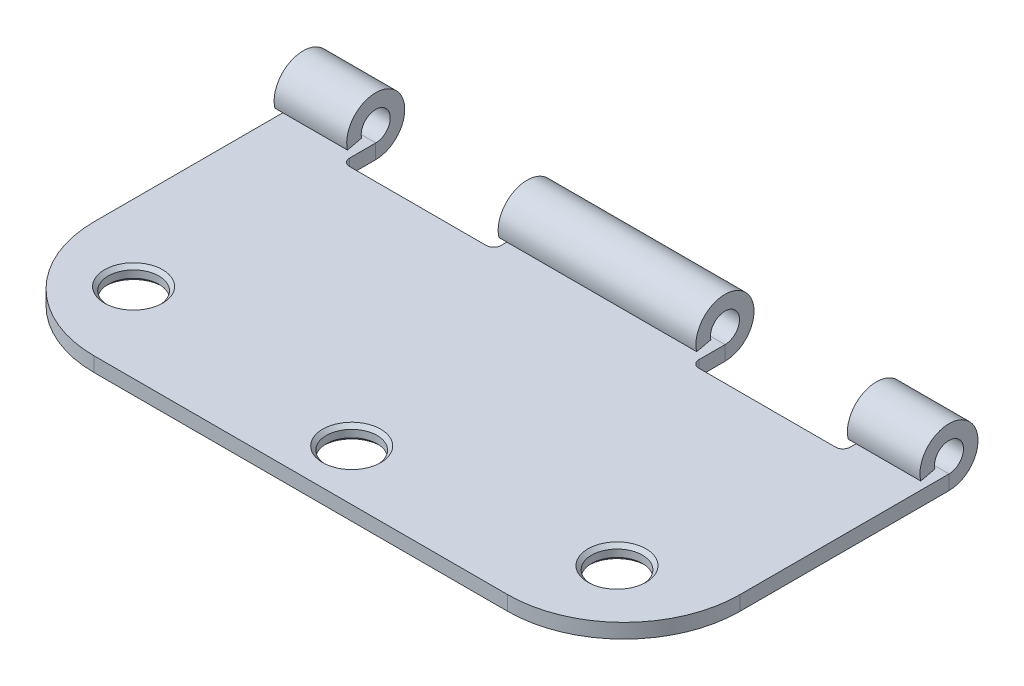
ISO-10303-21;
HEADER;
FILE_DESCRIPTION(('STEP AP214'),'2;1');
FILE_NAME('part.step','',(''),(''),'','','');
FILE_SCHEMA(('AUTOMOTIVE_DESIGN { 1 0 10303 214 1 1 1 1 }'));
ENDSEC;
DATA;
#1=APPLICATION_CONTEXT('core data for automotive mechanical design processes');
#2=APPLICATION_PROTOCOL_DEFINITION('international standard','automotive_design',2000,#1);
#3=PRODUCT_CONTEXT('',#1,'mechanical');
#4=PRODUCT('Part','Part','',(#3));
#5=PRODUCT_RELATED_PRODUCT_CATEGORY('part','',(#4));
#6=PRODUCT_DEFINITION_FORMATION('','',#4);
#7=PRODUCT_DEFINITION_CONTEXT('part definition',#1,'design');
#8=PRODUCT_DEFINITION('design','',#6,#7);
#9=PRODUCT_DEFINITION_SHAPE('','',#8);
#10=(LENGTH_UNIT() NAMED_UNIT(*) SI_UNIT(.MILLI.,.METRE.));
#11=(NAMED_UNIT(*) PLANE_ANGLE_UNIT() SI_UNIT($,.RADIAN.));
#12=(NAMED_UNIT(*) SI_UNIT($,.STERADIAN.) SOLID_ANGLE_UNIT());
#13=UNCERTAINTY_MEASURE_WITH_UNIT(LENGTH_MEASURE(1.E-05),#10,'distance_accuracy_value','');
#14=(GEOMETRIC_REPRESENTATION_CONTEXT(3) GLOBAL_UNCERTAINTY_ASSIGNED_CONTEXT((#13)) GLOBAL_UNIT_ASSIGNED_CONTEXT((#10,
#11,#12)) REPRESENTATION_CONTEXT('',''));
#15=CARTESIAN_POINT('',(0.,0.,0.));
#16=DIRECTION('',(0.,0.,1.));
#17=DIRECTION('',(1.,0.,0.));
#18=AXIS2_PLACEMENT_3D('',#15,#16,#17);
#19=CARTESIAN_POINT('',(79.,2.,-40.19));
#20=DIRECTION('',(1.,0.,0.));
#21=DIRECTION('',(0.,0.,1.));
#22=AXIS2_PLACEMENT_3D('',#19,#20,#21);
#23=PLANE('',#22);
#24=DIRECTION('',(0.,0.,-1.));
#25=VECTOR('',#24,1.);
#26=CARTESIAN_POINT('',(79.,0.,0.));
#27=LINE('',#26,#25);
#28=CARTESIAN_POINT('',(79.,0.,-44.81));
#29=VERTEX_POINT('',#28);
#30=CARTESIAN_POINT('',(79.,0.,-41.2));
#31=VERTEX_POINT('',#30);
#32=EDGE_CURVE('E223',#29,#31,#27,.F.);
#33=ORIENTED_EDGE('',*,*,#32,.T.);
#34=DIRECTION('',(0.,-1.,0.));
#35=VECTOR('',#34,1.);
#36=CARTESIAN_POINT('',(79.,2.,-41.2));
#37=LINE('',#36,#35);
#38=CARTESIAN_POINT('',(79.,2.,-41.2));
#39=VERTEX_POINT('',#38);
#40=EDGE_CURVE('E455',#31,#39,#37,.F.);
#41=ORIENTED_EDGE('',*,*,#40,.T.);
#42=DIRECTION('',(0.,0.,1.));
#43=VECTOR('',#42,1.);
#44=CARTESIAN_POINT('',(79.,2.,-40.19));
#45=LINE('',#44,#43);
#46=CARTESIAN_POINT('',(79.,2.,-44.81));
#47=VERTEX_POINT('',#46);
#48=EDGE_CURVE('E379',#47,#39,#45,.T.);
#49=ORIENTED_EDGE('',*,*,#48,.F.);
#50=DIRECTION('',(0.,-1.,0.));
#51=VECTOR('',#50,1.);
#52=CARTESIAN_POINT('',(79.,2.,-44.81));
#53=LINE('',#52,#51);
#54=EDGE_CURVE('E236',#47,#29,#53,.T.);
#55=ORIENTED_EDGE('',*,*,#54,.T.);
#56=EDGE_LOOP('',(#33,#41,#49,#55));
#57=FACE_BOUND('',#56,.T.);
#58=ADVANCED_FACE('F49',(#57),#23,.F.);
#59=CARTESIAN_POINT('',(30.86930285876,2.,-40.19));
#60=DIRECTION('',(1.,0.,0.));
#61=DIRECTION('',(0.,0.,1.));
#62=AXIS2_PLACEMENT_3D('',#59,#60,#61);
#63=PLANE('',#62);
#64=DIRECTION('',(0.,0.,-1.));
#65=VECTOR('',#64,1.);
#66=CARTESIAN_POINT('',(30.86930285876,0.,0.));
#67=LINE('',#66,#65);
#68=CARTESIAN_POINT('',(30.86930285876,0.,-44.81));
#69=VERTEX_POINT('',#68);
#70=CARTESIAN_POINT('',(30.86930285876,0.,-41.2));
#71=VERTEX_POINT('',#70);
#72=EDGE_CURVE('E418',#69,#71,#67,.F.);
#73=ORIENTED_EDGE('',*,*,#72,.T.);
#74=DIRECTION('',(0.,-1.,0.));
#75=VECTOR('',#74,1.);
#76=CARTESIAN_POINT('',(30.86930285876,2.,-41.2));
#77=LINE('',#76,#75);
#78=CARTESIAN_POINT('',(30.86930285876,2.,-41.2));
#79=VERTEX_POINT('',#78);
#80=EDGE_CURVE('E469',#71,#79,#77,.F.);
#81=ORIENTED_EDGE('',*,*,#80,.T.);
#82=DIRECTION('',(0.,0.,1.));
#83=VECTOR('',#82,1.);
#84=CARTESIAN_POINT('',(30.86930285876,2.,-40.19));
#85=LINE('',#84,#83);
#86=CARTESIAN_POINT('',(30.86930285876,2.,-44.81));
#87=VERTEX_POINT('',#86);
#88=EDGE_CURVE('E390',#87,#79,#85,.T.);
#89=ORIENTED_EDGE('',*,*,#88,.F.);
#90=DIRECTION('',(0.,-1.,0.));
#91=VECTOR('',#90,1.);
#92=CARTESIAN_POINT('',(30.86930285876,2.,-44.81));
#93=LINE('',#92,#91);
#94=EDGE_CURVE('E291',#87,#69,#93,.T.);
#95=ORIENTED_EDGE('',*,*,#94,.T.);
#96=EDGE_LOOP('',(#73,#81,#89,#95));
#97=FACE_BOUND('',#96,.T.);
#98=ADVANCED_FACE('F573',(#97),#63,.F.);
#99=CARTESIAN_POINT('',(0.,2.,0.));
#100=DIRECTION('',(1.,0.,0.));
#101=DIRECTION('',(0.,0.,1.));
#102=AXIS2_PLACEMENT_3D('',#99,#100,#101);
#103=PLANE('',#102);
#104=DIRECTION('',(0.,0.,-1.));
#105=VECTOR('',#104,1.);
#106=CARTESIAN_POINT('',(0.,0.,0.));
#107=LINE('',#106,#105);
#108=CARTESIAN_POINT('',(0.,0.,-44.81));
#109=VERTEX_POINT('',#108);
#110=CARTESIAN_POINT('',(0.,0.,-16.));
#111=VERTEX_POINT('',#110);
#112=EDGE_CURVE('E376',#109,#111,#107,.F.);
#113=ORIENTED_EDGE('',*,*,#112,.T.);
#114=DIRECTION('',(0.,-1.,0.));
#115=VECTOR('',#114,1.);
#116=CARTESIAN_POINT('',(0.,2.,-16.));
#117=LINE('',#116,#115);
#118=CARTESIAN_POINT('',(0.,2.,-16.));
#119=VERTEX_POINT('',#118);
#120=EDGE_CURVE('E404',#111,#119,#117,.F.);
#121=ORIENTED_EDGE('',*,*,#120,.T.);
#122=DIRECTION('',(0.,0.,1.));
#123=VECTOR('',#122,1.);
#124=CARTESIAN_POINT('',(0.,2.,0.));
#125=LINE('',#124,#123);
#126=CARTESIAN_POINT('',(0.,2.,-44.81));
#127=VERTEX_POINT('',#126);
#128=EDGE_CURVE('E400',#127,#119,#125,.T.);
#129=ORIENTED_EDGE('',*,*,#128,.F.);
#130=DIRECTION('',(0.,-1.,0.));
#131=VECTOR('',#130,1.);
#132=CARTESIAN_POINT('',(0.,2.,-44.81));
#133=LINE('',#132,#131);
#134=EDGE_CURVE('E336',#127,#109,#133,.T.);
#135=ORIENTED_EDGE('',*,*,#134,.T.);
#136=EDGE_LOOP('',(#113,#121,#129,#135));
#137=FACE_BOUND('',#136,.T.);
#138=ADVANCED_FACE('F580',(#137),#103,.F.);
#139=CARTESIAN_POINT('',(58.13069714124,2.,-40.19));
#140=DIRECTION('',(0.,0.,1.));
#141=DIRECTION('',(-1.,0.,0.));
#142=AXIS2_PLACEMENT_3D('',#139,#140,#141);
#143=PLANE('',#142);
#144=DIRECTION('',(-1.,0.,0.));
#145=VECTOR('',#144,1.);
#146=CARTESIAN_POINT('',(58.13069714124,2.,-40.19));
#147=LINE('',#146,#145);
#148=CARTESIAN_POINT('',(77.99,2.,-40.19));
#149=VERTEX_POINT('',#148);
#150=CARTESIAN_POINT('',(59.14069714124,2.,-40.19));
#151=VERTEX_POINT('',#150);
#152=EDGE_CURVE('E383',#149,#151,#147,.T.);
#153=ORIENTED_EDGE('',*,*,#152,.F.);
#154=DIRECTION('',(0.,-1.,0.));
#155=VECTOR('',#154,1.);
#156=CARTESIAN_POINT('',(77.99,0.,-40.19));
#157=LINE('',#156,#155);
#158=CARTESIAN_POINT('',(77.99,0.,-40.19));
#159=VERTEX_POINT('',#158);
#160=EDGE_CURVE('E463',#149,#159,#157,.T.);
#161=ORIENTED_EDGE('',*,*,#160,.T.);
#162=DIRECTION('',(1.,0.,0.));
#163=VECTOR('',#162,1.);
#164=CARTESIAN_POINT('',(0.,0.,-40.19));
#165=LINE('',#164,#163);
#166=CARTESIAN_POINT('',(59.14069714124,0.,-40.19));
#167=VERTEX_POINT('',#166);
#168=EDGE_CURVE('E425',#159,#167,#165,.F.);
#169=ORIENTED_EDGE('',*,*,#168,.T.);
#170=DIRECTION('',(0.,-1.,0.));
#171=VECTOR('',#170,1.);
#172=CARTESIAN_POINT('',(59.14069714124,2.,-40.19));
#173=LINE('',#172,#171);
#174=EDGE_CURVE('E459',#167,#151,#173,.F.);
#175=ORIENTED_EDGE('',*,*,#174,.T.);
#176=EDGE_LOOP('',(#153,#161,#169,#175));
#177=FACE_BOUND('',#176,.T.);
#178=ADVANCED_FACE('F585',(#177),#143,.F.);
#179=CARTESIAN_POINT('',(58.13069714124,2.,-48.81));
#180=DIRECTION('',(-1.,0.,0.));
#181=DIRECTION('',(0.,0.,-1.));
#182=AXIS2_PLACEMENT_3D('',#179,#180,#181);
#183=PLANE('',#182);
#184=DIRECTION('',(0.,0.,-1.));
#185=VECTOR('',#184,1.);
#186=CARTESIAN_POINT('',(58.13069714124,2.,-48.81));
#187=LINE('',#186,#185);
#188=CARTESIAN_POINT('',(58.13069714124,2.,-41.2));
#189=VERTEX_POINT('',#188);
#190=CARTESIAN_POINT('',(58.13069714124,2.,-44.81));
#191=VERTEX_POINT('',#190);
#192=EDGE_CURVE('E387',#189,#191,#187,.T.);
#193=ORIENTED_EDGE('',*,*,#192,.F.);
#194=DIRECTION('',(0.,-1.,0.));
#195=VECTOR('',#194,1.);
#196=CARTESIAN_POINT('',(58.13069714124,0.,-41.2));
#197=LINE('',#196,#195);
#198=CARTESIAN_POINT('',(58.13069714124,0.,-41.2));
#199=VERTEX_POINT('',#198);
#200=EDGE_CURVE('E466',#189,#199,#197,.T.);
#201=ORIENTED_EDGE('',*,*,#200,.T.);
#202=DIRECTION('',(0.,0.,-1.));
#203=VECTOR('',#202,1.);
#204=CARTESIAN_POINT('',(58.13069714124,0.,0.));
#205=LINE('',#204,#203);
#206=CARTESIAN_POINT('',(58.13069714124,0.,-44.81));
#207=VERTEX_POINT('',#206);
#208=EDGE_CURVE('E422',#199,#207,#205,.T.);
#209=ORIENTED_EDGE('',*,*,#208,.T.);
#210=DIRECTION('',(0.,-1.,0.));
#211=VECTOR('',#210,1.);
#212=CARTESIAN_POINT('',(58.13069714124,2.,-44.81));
#213=LINE('',#212,#211);
#214=EDGE_CURVE('E313',#191,#207,#213,.T.);
#215=ORIENTED_EDGE('',*,*,#214,.F.);
#216=EDGE_LOOP('',(#193,#201,#209,#215));
#217=FACE_BOUND('',#216,.T.);
#218=ADVANCED_FACE('F748',(#217),#183,.F.);
#219=CARTESIAN_POINT('',(10.,2.,-40.19));
#220=DIRECTION('',(0.,0.,1.));
#221=DIRECTION('',(-1.,0.,0.));
#222=AXIS2_PLACEMENT_3D('',#219,#220,#221);
#223=PLANE('',#222);
#224=DIRECTION('',(-1.,0.,0.));
#225=VECTOR('',#224,1.);
#226=CARTESIAN_POINT('',(10.,2.,-40.19));
#227=LINE('',#226,#225);
#228=CARTESIAN_POINT('',(29.85930285876,2.,-40.19));
#229=VERTEX_POINT('',#228);
#230=CARTESIAN_POINT('',(11.01,2.,-40.19));
#231=VERTEX_POINT('',#230);
#232=EDGE_CURVE('E394',#229,#231,#227,.T.);
#233=ORIENTED_EDGE('',*,*,#232,.F.);
#234=DIRECTION('',(0.,-1.,0.));
#235=VECTOR('',#234,1.);
#236=CARTESIAN_POINT('',(29.85930285876,0.,-40.19));
#237=LINE('',#236,#235);
#238=CARTESIAN_POINT('',(29.85930285876,0.,-40.19));
#239=VERTEX_POINT('',#238);
#240=EDGE_CURVE('E477',#229,#239,#237,.T.);
#241=ORIENTED_EDGE('',*,*,#240,.T.);
#242=DIRECTION('',(1.,0.,0.));
#243=VECTOR('',#242,1.);
#244=CARTESIAN_POINT('',(0.,0.,-40.19));
#245=LINE('',#244,#243);
#246=CARTESIAN_POINT('',(11.01,0.,-40.19));
#247=VERTEX_POINT('',#246);
#248=EDGE_CURVE('E414',#239,#247,#245,.F.);
#249=ORIENTED_EDGE('',*,*,#248,.T.);
#250=DIRECTION('',(0.,-1.,0.));
#251=VECTOR('',#250,1.);
#252=CARTESIAN_POINT('',(11.01,2.,-40.19));
#253=LINE('',#252,#251);
#254=EDGE_CURVE('E473',#247,#231,#253,.F.);
#255=ORIENTED_EDGE('',*,*,#254,.T.);
#256=EDGE_LOOP('',(#233,#241,#249,#255));
#257=FACE_BOUND('',#256,.T.);
#258=ADVANCED_FACE('F729',(#257),#223,.F.);
#259=CARTESIAN_POINT('',(10.,2.,-48.81));
#260=DIRECTION('',(-1.,0.,0.));
#261=DIRECTION('',(0.,0.,-1.));
#262=AXIS2_PLACEMENT_3D('',#259,#260,#261);
#263=PLANE('',#262);
#264=DIRECTION('',(0.,0.,-1.));
#265=VECTOR('',#264,1.);
#266=CARTESIAN_POINT('',(10.,2.,-48.81));
#267=LINE('',#266,#265);
#268=CARTESIAN_POINT('',(10.,2.,-41.2));
#269=VERTEX_POINT('',#268);
#270=CARTESIAN_POINT('',(9.99999999999999,2.,-44.81));
#271=VERTEX_POINT('',#270);
#272=EDGE_CURVE('E397',#269,#271,#267,.T.);
#273=ORIENTED_EDGE('',*,*,#272,.F.);
#274=DIRECTION('',(0.,-1.,0.));
#275=VECTOR('',#274,1.);
#276=CARTESIAN_POINT('',(10.,0.,-41.2));
#277=LINE('',#276,#275);
#278=CARTESIAN_POINT('',(10.,0.,-41.2));
#279=VERTEX_POINT('',#278);
#280=EDGE_CURVE('E66',#269,#279,#277,.T.);
#281=ORIENTED_EDGE('',*,*,#280,.T.);
#282=DIRECTION('',(0.,0.,-1.));
#283=VECTOR('',#282,1.);
#284=CARTESIAN_POINT('',(10.,0.,0.));
#285=LINE('',#284,#283);
#286=CARTESIAN_POINT('',(9.99999999999999,0.,-44.81));
#287=VERTEX_POINT('',#286);
#288=EDGE_CURVE('E411',#279,#287,#285,.T.);
#289=ORIENTED_EDGE('',*,*,#288,.T.);
#290=DIRECTION('',(0.,-1.,0.));
#291=VECTOR('',#290,1.);
#292=CARTESIAN_POINT('',(9.99999999999999,2.,-44.81));
#293=LINE('',#292,#291);
#294=EDGE_CURVE('E358',#271,#287,#293,.T.);
#295=ORIENTED_EDGE('',*,*,#294,.F.);
#296=EDGE_LOOP('',(#273,#281,#289,#295));
#297=FACE_BOUND('',#296,.T.);
#298=ADVANCED_FACE('F722',(#297),#263,.F.);
#299=CARTESIAN_POINT('',(89.,2.,0.));
#300=DIRECTION('',(0.,0.,-1.));
#301=DIRECTION('',(1.,0.,0.));
#302=AXIS2_PLACEMENT_3D('',#299,#300,#301);
#303=PLANE('',#302);
#304=DIRECTION('',(1.,0.,0.));
#305=VECTOR('',#304,1.);
#306=CARTESIAN_POINT('',(89.,2.,0.));
#307=LINE('',#306,#305);
#308=CARTESIAN_POINT('',(16.,2.,0.));
#309=VERTEX_POINT('',#308);
#310=CARTESIAN_POINT('',(73.,2.,0.));
#311=VERTEX_POINT('',#310);
#312=EDGE_CURVE('E371',#309,#311,#307,.T.);
#313=ORIENTED_EDGE('',*,*,#312,.F.);
#314=DIRECTION('',(0.,-1.,0.));
#315=VECTOR('',#314,1.);
#316=CARTESIAN_POINT('',(16.,2.,0.));
#317=LINE('',#316,#315);
#318=CARTESIAN_POINT('',(16.,0.,0.));
#319=VERTEX_POINT('',#318);
#320=EDGE_CURVE('E444',#309,#319,#317,.T.);
#321=ORIENTED_EDGE('',*,*,#320,.T.);
#322=DIRECTION('',(1.,0.,0.));
#323=VECTOR('',#322,1.);
#324=CARTESIAN_POINT('',(0.,0.,0.));
#325=LINE('',#324,#323);
#326=CARTESIAN_POINT('',(73.,0.,0.));
#327=VERTEX_POINT('',#326);
#328=EDGE_CURVE('E224',#319,#327,#325,.T.);
#329=ORIENTED_EDGE('',*,*,#328,.T.);
#330=DIRECTION('',(0.,-1.,0.));
#331=VECTOR('',#330,1.);
#332=CARTESIAN_POINT('',(73.,2.,0.));
#333=LINE('',#332,#331);
#334=EDGE_CURVE('E440',#327,#311,#333,.F.);
#335=ORIENTED_EDGE('',*,*,#334,.T.);
#336=EDGE_LOOP('',(#313,#321,#329,#335));
#337=FACE_BOUND('',#336,.T.);
#338=ADVANCED_FACE('F589',(#337),#303,.F.);
#339=CARTESIAN_POINT('',(89.,2.,-48.81));
#340=DIRECTION('',(-1.,0.,0.));
#341=DIRECTION('',(0.,0.,-1.));
#342=AXIS2_PLACEMENT_3D('',#339,#340,#341);
#343=PLANE('',#342);
#344=DIRECTION('',(0.,0.,-1.));
#345=VECTOR('',#344,1.);
#346=CARTESIAN_POINT('',(89.,2.,-48.81));
#347=LINE('',#346,#345);
#348=CARTESIAN_POINT('',(89.,2.,-16.));
#349=VERTEX_POINT('',#348);
#350=CARTESIAN_POINT('',(89.,2.,-44.81));
#351=VERTEX_POINT('',#350);
#352=EDGE_CURVE('E375',#349,#351,#347,.T.);
#353=ORIENTED_EDGE('',*,*,#352,.F.);
#354=DIRECTION('',(0.,-1.,0.));
#355=VECTOR('',#354,1.);
#356=CARTESIAN_POINT('',(89.,2.,-16.));
#357=LINE('',#356,#355);
#358=CARTESIAN_POINT('',(89.,0.,-16.));
#359=VERTEX_POINT('',#358);
#360=EDGE_CURVE('E218',#349,#359,#357,.T.);
#361=ORIENTED_EDGE('',*,*,#360,.T.);
#362=DIRECTION('',(0.,0.,-1.));
#363=VECTOR('',#362,1.);
#364=CARTESIAN_POINT('',(89.,0.,0.));
#365=LINE('',#364,#363);
#366=CARTESIAN_POINT('',(89.,0.,-44.81));
#367=VERTEX_POINT('',#366);
#368=EDGE_CURVE('E212',#359,#367,#365,.T.);
#369=ORIENTED_EDGE('',*,*,#368,.T.);
#370=DIRECTION('',(0.,-1.,0.));
#371=VECTOR('',#370,1.);
#372=CARTESIAN_POINT('',(89.,2.,-44.81));
#373=LINE('',#372,#371);
#374=EDGE_CURVE('E216',#351,#367,#373,.T.);
#375=ORIENTED_EDGE('',*,*,#374,.F.);
#376=EDGE_LOOP('',(#353,#361,#369,#375));
#377=FACE_BOUND('',#376,.T.);
#378=ADVANCED_FACE('F215',(#377),#343,.F.);
#379=CARTESIAN_POINT('',(0.,2.,0.));
#380=DIRECTION('',(0.,-1.,0.));
#381=DIRECTION('',(0.,0.,-1.));
#382=AXIS2_PLACEMENT_3D('',#379,#380,#381);
#383=PLANE('',#382);
#384=CARTESIAN_POINT('',(10.4413691970676,2.,-11.));
#385=DIRECTION('',(0.,-1.,0.));
#386=DIRECTION('',(0.,0.,-1.));
#387=AXIS2_PLACEMENT_3D('',#384,#385,#386);
#388=CIRCLE('',#387,4.);
#389=CARTESIAN_POINT('',(10.4413691970676,2.,-15.));
#390=VERTEX_POINT('',#389);
#391=EDGE_CURVE('E521',#390,#390,#388,.T.);
#392=ORIENTED_EDGE('',*,*,#391,.T.);
#393=EDGE_LOOP('',(#392));
#394=FACE_BOUND('',#393,.T.);
#395=CARTESIAN_POINT('',(77.0613747875836,2.,-11.));
#396=DIRECTION('',(0.,-1.,0.));
#397=DIRECTION('',(0.,0.,-1.));
#398=AXIS2_PLACEMENT_3D('',#395,#396,#397);
#399=CIRCLE('',#398,3.99999999999999);
#400=CARTESIAN_POINT('',(77.0613747875836,2.,-15.));
#401=VERTEX_POINT('',#400);
#402=EDGE_CURVE('E517',#401,#401,#399,.T.);
#403=ORIENTED_EDGE('',*,*,#402,.T.);
#404=EDGE_LOOP('',(#403));
#405=FACE_BOUND('',#404,.T.);
#406=CARTESIAN_POINT('',(44.5,2.,-7.));
#407=DIRECTION('',(0.,-1.,0.));
#408=DIRECTION('',(0.,0.,-1.));
#409=AXIS2_PLACEMENT_3D('',#406,#407,#408);
#410=CIRCLE('',#409,3.99999999999998);
#411=CARTESIAN_POINT('',(44.5,2.,-11.));
#412=VERTEX_POINT('',#411);
#413=EDGE_CURVE('E513',#412,#412,#410,.T.);
#414=ORIENTED_EDGE('',*,*,#413,.T.);
#415=EDGE_LOOP('',(#414));
#416=FACE_BOUND('',#415,.T.);
#417=ORIENTED_EDGE('',*,*,#128,.T.);
#418=CARTESIAN_POINT('',(16.,2.,-16.));
#419=DIRECTION('',(0.,-1.,0.));
#420=DIRECTION('',(0.,0.,-1.));
#421=AXIS2_PLACEMENT_3D('',#418,#419,#420);
#422=CIRCLE('',#421,16.);
#423=EDGE_CURVE('E437',#119,#309,#422,.F.);
#424=ORIENTED_EDGE('',*,*,#423,.T.);
#425=ORIENTED_EDGE('',*,*,#312,.T.);
#426=CARTESIAN_POINT('',(73.,2.,-16.));
#427=DIRECTION('',(0.,-1.,0.));
#428=DIRECTION('',(0.,0.,-1.));
#429=AXIS2_PLACEMENT_3D('',#426,#427,#428);
#430=CIRCLE('',#429,16.);
#431=EDGE_CURVE('E434',#311,#349,#430,.F.);
#432=ORIENTED_EDGE('',*,*,#431,.T.);
#433=ORIENTED_EDGE('',*,*,#352,.T.);
#434=DIRECTION('',(-1.,0.,0.));
#435=VECTOR('',#434,1.);
#436=CARTESIAN_POINT('',(79.,2.,-44.81));
#437=LINE('',#436,#435);
#438=EDGE_CURVE('E263',#47,#351,#437,.F.);
#439=ORIENTED_EDGE('',*,*,#438,.F.);
#440=ORIENTED_EDGE('',*,*,#48,.T.);
#441=CARTESIAN_POINT('',(77.99,2.,-41.2));
#442=DIRECTION('',(0.,-1.,0.));
#443=DIRECTION('',(0.,0.,-1.));
#444=AXIS2_PLACEMENT_3D('',#441,#442,#443);
#445=CIRCLE('',#444,1.01);
#446=EDGE_CURVE('E482',#39,#149,#445,.T.);
#447=ORIENTED_EDGE('',*,*,#446,.T.);
#448=ORIENTED_EDGE('',*,*,#152,.T.);
#449=CARTESIAN_POINT('',(59.14069714124,2.,-41.2));
#450=DIRECTION('',(0.,-1.,0.));
#451=DIRECTION('',(0.,0.,-1.));
#452=AXIS2_PLACEMENT_3D('',#449,#450,#451);
#453=CIRCLE('',#452,1.01);
#454=EDGE_CURVE('E488',#151,#189,#453,.T.);
#455=ORIENTED_EDGE('',*,*,#454,.T.);
#456=ORIENTED_EDGE('',*,*,#192,.T.);
#457=DIRECTION('',(-1.,0.,0.));
#458=VECTOR('',#457,1.);
#459=CARTESIAN_POINT('',(30.86930285876,2.,-44.81));
#460=LINE('',#459,#458);
#461=EDGE_CURVE('E303',#87,#191,#460,.F.);
#462=ORIENTED_EDGE('',*,*,#461,.F.);
#463=ORIENTED_EDGE('',*,*,#88,.T.);
#464=CARTESIAN_POINT('',(29.85930285876,2.,-41.2));
#465=DIRECTION('',(0.,-1.,0.));
#466=DIRECTION('',(0.,0.,-1.));
#467=AXIS2_PLACEMENT_3D('',#464,#465,#466);
#468=CIRCLE('',#467,1.01);
#469=EDGE_CURVE('E494',#79,#229,#468,.T.);
#470=ORIENTED_EDGE('',*,*,#469,.T.);
#471=ORIENTED_EDGE('',*,*,#232,.T.);
#472=CARTESIAN_POINT('',(11.01,2.,-41.2));
#473=DIRECTION('',(0.,-1.,0.));
#474=DIRECTION('',(0.,0.,-1.));
#475=AXIS2_PLACEMENT_3D('',#472,#473,#474);
#476=CIRCLE('',#475,1.01);
#477=EDGE_CURVE('E74',#231,#269,#476,.T.);
#478=ORIENTED_EDGE('',*,*,#477,.T.);
#479=ORIENTED_EDGE('',*,*,#272,.T.);
#480=DIRECTION('',(-1.,0.,0.));
#481=VECTOR('',#480,1.);
#482=CARTESIAN_POINT('',(0.,2.,-44.81));
#483=LINE('',#482,#481);
#484=EDGE_CURVE('E348',#127,#271,#483,.F.);
#485=ORIENTED_EDGE('',*,*,#484,.F.);
#486=EDGE_LOOP('',(#417,#424,#425,#432,#433,#439,#440,#447,#448,#455,#456,#462,#463,#470,#471,
#478,#479,#485));
#487=FACE_BOUND('',#486,.T.);
#488=ADVANCED_FACE('F557',(#394,#405,#416,#487),#383,.F.);
#489=CARTESIAN_POINT('',(0.,0.,0.));
#490=DIRECTION('',(0.,-1.,0.));
#491=DIRECTION('',(0.,0.,-1.));
#492=AXIS2_PLACEMENT_3D('',#489,#490,#491);
#493=PLANE('',#492);
#494=CARTESIAN_POINT('',(10.4413691970676,0.,-11.));
#495=DIRECTION('',(0.,-1.,0.));
#496=DIRECTION('',(0.,0.,-1.));
#497=AXIS2_PLACEMENT_3D('',#494,#495,#496);
#498=CIRCLE('',#497,3.99999999999999);
#499=CARTESIAN_POINT('',(10.4413691970676,0.,-15.));
#500=VERTEX_POINT('',#499);
#501=EDGE_CURVE('E533',#500,#500,#498,.F.);
#502=ORIENTED_EDGE('',*,*,#501,.T.);
#503=EDGE_LOOP('',(#502));
#504=FACE_BOUND('',#503,.T.);
#505=CARTESIAN_POINT('',(77.0613747875836,0.,-11.));
#506=DIRECTION('',(0.,-1.,0.));
#507=DIRECTION('',(0.,0.,-1.));
#508=AXIS2_PLACEMENT_3D('',#505,#506,#507);
#509=CIRCLE('',#508,3.99999999999999);
#510=CARTESIAN_POINT('',(77.0613747875836,0.,-15.));
#511=VERTEX_POINT('',#510);
#512=EDGE_CURVE('E529',#511,#511,#509,.F.);
#513=ORIENTED_EDGE('',*,*,#512,.T.);
#514=EDGE_LOOP('',(#513));
#515=FACE_BOUND('',#514,.T.);
#516=CARTESIAN_POINT('',(44.5,0.,-7.));
#517=DIRECTION('',(0.,-1.,0.));
#518=DIRECTION('',(0.,0.,-1.));
#519=AXIS2_PLACEMENT_3D('',#516,#517,#518);
#520=CIRCLE('',#519,3.99999999999999);
#521=CARTESIAN_POINT('',(44.5,0.,-11.));
#522=VERTEX_POINT('',#521);
#523=EDGE_CURVE('E525',#522,#522,#520,.F.);
#524=ORIENTED_EDGE('',*,*,#523,.T.);
#525=EDGE_LOOP('',(#524));
#526=FACE_BOUND('',#525,.T.);
#527=ORIENTED_EDGE('',*,*,#328,.F.);
#528=CARTESIAN_POINT('',(16.,0.,-16.));
#529=DIRECTION('',(0.,-1.,0.));
#530=DIRECTION('',(0.,0.,-1.));
#531=AXIS2_PLACEMENT_3D('',#528,#529,#530);
#532=CIRCLE('',#531,16.);
#533=EDGE_CURVE('E450',#319,#111,#532,.T.);
#534=ORIENTED_EDGE('',*,*,#533,.T.);
#535=ORIENTED_EDGE('',*,*,#112,.F.);
#536=DIRECTION('',(-1.,0.,0.));
#537=VECTOR('',#536,1.);
#538=CARTESIAN_POINT('',(0.,0.,-44.81));
#539=LINE('',#538,#537);
#540=EDGE_CURVE('E327',#109,#287,#539,.F.);
#541=ORIENTED_EDGE('',*,*,#540,.T.);
#542=ORIENTED_EDGE('',*,*,#288,.F.);
#543=CARTESIAN_POINT('',(11.01,0.,-41.2));
#544=DIRECTION('',(0.,-1.,0.));
#545=DIRECTION('',(0.,0.,-1.));
#546=AXIS2_PLACEMENT_3D('',#543,#544,#545);
#547=CIRCLE('',#546,1.01);
#548=EDGE_CURVE('E502',#279,#247,#547,.F.);
#549=ORIENTED_EDGE('',*,*,#548,.T.);
#550=ORIENTED_EDGE('',*,*,#248,.F.);
#551=CARTESIAN_POINT('',(29.85930285876,0.,-41.2));
#552=DIRECTION('',(0.,-1.,0.));
#553=DIRECTION('',(0.,0.,-1.));
#554=AXIS2_PLACEMENT_3D('',#551,#552,#553);
#555=CIRCLE('',#554,1.01);
#556=EDGE_CURVE('E497',#239,#71,#555,.F.);
#557=ORIENTED_EDGE('',*,*,#556,.T.);
#558=ORIENTED_EDGE('',*,*,#72,.F.);
#559=DIRECTION('',(-1.,0.,0.));
#560=VECTOR('',#559,1.);
#561=CARTESIAN_POINT('',(30.86930285876,0.,-44.81));
#562=LINE('',#561,#560);
#563=EDGE_CURVE('E282',#69,#207,#562,.F.);
#564=ORIENTED_EDGE('',*,*,#563,.T.);
#565=ORIENTED_EDGE('',*,*,#208,.F.);
#566=CARTESIAN_POINT('',(59.14069714124,0.,-41.2));
#567=DIRECTION('',(0.,-1.,0.));
#568=DIRECTION('',(0.,0.,-1.));
#569=AXIS2_PLACEMENT_3D('',#566,#567,#568);
#570=CIRCLE('',#569,1.01);
#571=EDGE_CURVE('E491',#199,#167,#570,.F.);
#572=ORIENTED_EDGE('',*,*,#571,.T.);
#573=ORIENTED_EDGE('',*,*,#168,.F.);
#574=CARTESIAN_POINT('',(77.99,0.,-41.2));
#575=DIRECTION('',(0.,-1.,0.));
#576=DIRECTION('',(0.,0.,-1.));
#577=AXIS2_PLACEMENT_3D('',#574,#575,#576);
#578=CIRCLE('',#577,1.01);
#579=EDGE_CURVE('E485',#159,#31,#578,.F.);
#580=ORIENTED_EDGE('',*,*,#579,.T.);
#581=ORIENTED_EDGE('',*,*,#32,.F.);
#582=DIRECTION('',(-1.,0.,0.));
#583=VECTOR('',#582,1.);
#584=CARTESIAN_POINT('',(79.,0.,-44.81));
#585=LINE('',#584,#583);
#586=EDGE_CURVE('E242',#29,#367,#585,.F.);
#587=ORIENTED_EDGE('',*,*,#586,.T.);
#588=ORIENTED_EDGE('',*,*,#368,.F.);
#589=CARTESIAN_POINT('',(73.,0.,-16.));
#590=DIRECTION('',(0.,-1.,0.));
#591=DIRECTION('',(0.,0.,-1.));
#592=AXIS2_PLACEMENT_3D('',#589,#590,#591);
#593=CIRCLE('',#592,16.);
#594=EDGE_CURVE('E447',#359,#327,#593,.T.);
#595=ORIENTED_EDGE('',*,*,#594,.T.);
#596=EDGE_LOOP('',(#527,#534,#535,#541,#542,#549,#550,#557,#558,#564,#565,#572,#573,#580,#581,
#587,#588,#595));
#597=FACE_BOUND('',#596,.T.);
#598=ADVANCED_FACE('F250',(#504,#515,#526,#597),#493,.T.);
#599=CARTESIAN_POINT('',(5.,3.55009789131226,-42.8612598704295));
#600=DIRECTION('',(0.,0.974370064785234,0.224951054343872));
#601=DIRECTION('',(-1.,0.,0.));
#602=AXIS2_PLACEMENT_3D('',#599,#600,#601);
#603=PLANE('',#602);
#604=DIRECTION('',(0.,-0.224951054343872,0.974370064785234));
#605=VECTOR('',#604,1.);
#606=CARTESIAN_POINT('',(0.,3.55009789131226,-42.8612598704295));
#607=LINE('',#606,#605);
#608=CARTESIAN_POINT('',(0.,3.55009789131226,-42.8612598704295));
#609=VERTEX_POINT('',#608);
#610=CARTESIAN_POINT('',(0.,3.10019578262451,-40.9125197408591));
#611=VERTEX_POINT('',#610);
#612=EDGE_CURVE('E365',#609,#611,#607,.T.);
#613=ORIENTED_EDGE('',*,*,#612,.F.);
#614=DIRECTION('',(-1.,0.,0.));
#615=VECTOR('',#614,1.);
#616=CARTESIAN_POINT('',(0.,3.55009789131226,-42.8612598704295));
#617=LINE('',#616,#615);
#618=CARTESIAN_POINT('',(9.99999999999999,3.55009789131226,-42.8612598704295));
#619=VERTEX_POINT('',#618);
#620=EDGE_CURVE('E323',#619,#609,#617,.T.);
#621=ORIENTED_EDGE('',*,*,#620,.F.);
#622=DIRECTION('',(0.,-0.224951054343872,0.974370064785234));
#623=VECTOR('',#622,1.);
#624=CARTESIAN_POINT('',(9.99999999999999,3.55009789131226,-42.8612598704295));
#625=LINE('',#624,#623);
#626=CARTESIAN_POINT('',(9.99999999999999,3.10019578262451,-40.9125197408591));
#627=VERTEX_POINT('',#626);
#628=EDGE_CURVE('E362',#619,#627,#625,.T.);
#629=ORIENTED_EDGE('',*,*,#628,.T.);
#630=DIRECTION('',(-1.,0.,0.));
#631=VECTOR('',#630,1.);
#632=CARTESIAN_POINT('',(0.,3.10019578262451,-40.9125197408591));
#633=LINE('',#632,#631);
#634=EDGE_CURVE('E337',#627,#611,#633,.T.);
#635=ORIENTED_EDGE('',*,*,#634,.T.);
#636=EDGE_LOOP('',(#613,#621,#629,#635));
#637=FACE_BOUND('',#636,.T.);
#638=ADVANCED_FACE('F556',(#637),#603,.F.);
#639=CARTESIAN_POINT('',(9.99999999999999,4.,-44.81));
#640=DIRECTION('',(1.,0.,0.));
#641=DIRECTION('',(0.,0.,-1.));
#642=AXIS2_PLACEMENT_3D('',#639,#640,#641);
#643=PLANE('',#642);
#644=ORIENTED_EDGE('',*,*,#628,.F.);
#645=CARTESIAN_POINT('',(9.99999999999999,4.,-44.81));
#646=DIRECTION('',(-1.,0.,0.));
#647=DIRECTION('',(0.,0.,1.));
#648=AXIS2_PLACEMENT_3D('',#645,#646,#647);
#649=CIRCLE('',#648,2.);
#650=EDGE_CURVE('E341',#271,#619,#649,.F.);
#651=ORIENTED_EDGE('',*,*,#650,.F.);
#652=ORIENTED_EDGE('',*,*,#294,.T.);
#653=CARTESIAN_POINT('',(9.99999999999999,4.,-44.81));
#654=DIRECTION('',(-1.,0.,0.));
#655=DIRECTION('',(0.,0.,1.));
#656=AXIS2_PLACEMENT_3D('',#653,#654,#655);
#657=CIRCLE('',#656,4.);
#658=EDGE_CURVE('E331',#287,#627,#657,.F.);
#659=ORIENTED_EDGE('',*,*,#658,.T.);
#660=EDGE_LOOP('',(#644,#651,#652,#659));
#661=FACE_BOUND('',#660,.T.);
#662=ADVANCED_FACE('F565',(#661),#643,.T.);
#663=CARTESIAN_POINT('',(0.,4.,-44.81));
#664=DIRECTION('',(1.,0.,0.));
#665=DIRECTION('',(0.,0.,-1.));
#666=AXIS2_PLACEMENT_3D('',#663,#664,#665);
#667=PLANE('',#666);
#668=CARTESIAN_POINT('',(0.,4.,-44.81));
#669=DIRECTION('',(-1.,0.,0.));
#670=DIRECTION('',(0.,0.,1.));
#671=AXIS2_PLACEMENT_3D('',#668,#669,#670);
#672=CIRCLE('',#671,2.);
#673=EDGE_CURVE('E352',#609,#127,#672,.T.);
#674=ORIENTED_EDGE('',*,*,#673,.F.);
#675=ORIENTED_EDGE('',*,*,#612,.T.);
#676=CARTESIAN_POINT('',(0.,4.,-44.81));
#677=DIRECTION('',(-1.,0.,0.));
#678=DIRECTION('',(0.,0.,1.));
#679=AXIS2_PLACEMENT_3D('',#676,#677,#678);
#680=CIRCLE('',#679,4.);
#681=EDGE_CURVE('E332',#611,#109,#680,.T.);
#682=ORIENTED_EDGE('',*,*,#681,.T.);
#683=ORIENTED_EDGE('',*,*,#134,.F.);
#684=EDGE_LOOP('',(#674,#675,#682,#683));
#685=FACE_BOUND('',#684,.T.);
#686=ADVANCED_FACE('F701',(#685),#667,.F.);
#687=CARTESIAN_POINT('',(0.,4.,-44.81));
#688=DIRECTION('',(-1.,0.,0.));
#689=DIRECTION('',(0.,-0.224951054343872,0.974370064785234));
#690=AXIS2_PLACEMENT_3D('',#687,#688,#689);
#691=CYLINDRICAL_SURFACE('',#690,4.);
#692=ORIENTED_EDGE('',*,*,#540,.F.);
#693=ORIENTED_EDGE('',*,*,#681,.F.);
#694=ORIENTED_EDGE('',*,*,#634,.F.);
#695=ORIENTED_EDGE('',*,*,#658,.F.);
#696=EDGE_LOOP('',(#692,#693,#694,#695));
#697=FACE_BOUND('',#696,.T.);
#698=ADVANCED_FACE('F698',(#697),#691,.T.);
#699=CARTESIAN_POINT('',(0.,4.,-44.81));
#700=DIRECTION('',(-1.,0.,0.));
#701=DIRECTION('',(0.,-0.224951054343872,0.974370064785234));
#702=AXIS2_PLACEMENT_3D('',#699,#700,#701);
#703=CYLINDRICAL_SURFACE('',#702,2.);
#704=ORIENTED_EDGE('',*,*,#484,.T.);
#705=ORIENTED_EDGE('',*,*,#650,.T.);
#706=ORIENTED_EDGE('',*,*,#620,.T.);
#707=ORIENTED_EDGE('',*,*,#673,.T.);
#708=EDGE_LOOP('',(#704,#705,#706,#707));
#709=FACE_BOUND('',#708,.T.);
#710=ADVANCED_FACE('F693',(#709),#703,.F.);
#711=CARTESIAN_POINT('',(44.5,3.55009789131226,-42.8612598704295));
#712=DIRECTION('',(0.,0.974370064785234,0.224951054343872));
#713=DIRECTION('',(-1.,0.,0.));
#714=AXIS2_PLACEMENT_3D('',#711,#712,#713);
#715=PLANE('',#714);
#716=DIRECTION('',(0.,-0.224951054343872,0.974370064785234));
#717=VECTOR('',#716,1.);
#718=CARTESIAN_POINT('',(30.86930285876,3.55009789131226,-42.8612598704295));
#719=LINE('',#718,#717);
#720=CARTESIAN_POINT('',(30.86930285876,3.55009789131226,-42.8612598704295));
#721=VERTEX_POINT('',#720);
#722=CARTESIAN_POINT('',(30.86930285876,3.10019578262451,-40.9125197408591));
#723=VERTEX_POINT('',#722);
#724=EDGE_CURVE('E320',#721,#723,#719,.T.);
#725=ORIENTED_EDGE('',*,*,#724,.F.);
#726=DIRECTION('',(-1.,0.,0.));
#727=VECTOR('',#726,1.);
#728=CARTESIAN_POINT('',(30.86930285876,3.55009789131226,-42.8612598704295));
#729=LINE('',#728,#727);
#730=CARTESIAN_POINT('',(58.13069714124,3.55009789131226,-42.8612598704295));
#731=VERTEX_POINT('',#730);
#732=EDGE_CURVE('E279',#731,#721,#729,.T.);
#733=ORIENTED_EDGE('',*,*,#732,.F.);
#734=DIRECTION('',(0.,-0.224951054343872,0.974370064785234));
#735=VECTOR('',#734,1.);
#736=CARTESIAN_POINT('',(58.13069714124,3.55009789131226,-42.8612598704295));
#737=LINE('',#736,#735);
#738=CARTESIAN_POINT('',(58.13069714124,3.10019578262451,-40.9125197408591));
#739=VERTEX_POINT('',#738);
#740=EDGE_CURVE('E317',#731,#739,#737,.T.);
#741=ORIENTED_EDGE('',*,*,#740,.T.);
#742=DIRECTION('',(-1.,0.,0.));
#743=VECTOR('',#742,1.);
#744=CARTESIAN_POINT('',(30.86930285876,3.10019578262451,-40.9125197408591));
#745=LINE('',#744,#743);
#746=EDGE_CURVE('E292',#739,#723,#745,.T.);
#747=ORIENTED_EDGE('',*,*,#746,.T.);
#748=EDGE_LOOP('',(#725,#733,#741,#747));
#749=FACE_BOUND('',#748,.T.);
#750=ADVANCED_FACE('F689',(#749),#715,.F.);
#751=CARTESIAN_POINT('',(58.13069714124,4.,-44.81));
#752=DIRECTION('',(1.,0.,0.));
#753=DIRECTION('',(0.,0.,-1.));
#754=AXIS2_PLACEMENT_3D('',#751,#752,#753);
#755=PLANE('',#754);
#756=ORIENTED_EDGE('',*,*,#740,.F.);
#757=CARTESIAN_POINT('',(58.13069714124,4.,-44.81));
#758=DIRECTION('',(-1.,0.,0.));
#759=DIRECTION('',(0.,0.,1.));
#760=AXIS2_PLACEMENT_3D('',#757,#758,#759);
#761=CIRCLE('',#760,2.);
#762=EDGE_CURVE('E296',#191,#731,#761,.F.);
#763=ORIENTED_EDGE('',*,*,#762,.F.);
#764=ORIENTED_EDGE('',*,*,#214,.T.);
#765=CARTESIAN_POINT('',(58.13069714124,4.,-44.81));
#766=DIRECTION('',(-1.,0.,0.));
#767=DIRECTION('',(0.,0.,1.));
#768=AXIS2_PLACEMENT_3D('',#765,#766,#767);
#769=CIRCLE('',#768,4.);
#770=EDGE_CURVE('E286',#207,#739,#769,.F.);
#771=ORIENTED_EDGE('',*,*,#770,.T.);
#772=EDGE_LOOP('',(#756,#763,#764,#771));
#773=FACE_BOUND('',#772,.T.);
#774=ADVANCED_FACE('F686',(#773),#755,.T.);
#775=CARTESIAN_POINT('',(30.86930285876,4.,-44.81));
#776=DIRECTION('',(1.,0.,0.));
#777=DIRECTION('',(0.,0.,-1.));
#778=AXIS2_PLACEMENT_3D('',#775,#776,#777);
#779=PLANE('',#778);
#780=CARTESIAN_POINT('',(30.86930285876,4.,-44.81));
#781=DIRECTION('',(-1.,0.,0.));
#782=DIRECTION('',(0.,0.,1.));
#783=AXIS2_PLACEMENT_3D('',#780,#781,#782);
#784=CIRCLE('',#783,2.);
#785=EDGE_CURVE('E307',#721,#87,#784,.T.);
#786=ORIENTED_EDGE('',*,*,#785,.F.);
#787=ORIENTED_EDGE('',*,*,#724,.T.);
#788=CARTESIAN_POINT('',(30.86930285876,4.,-44.81));
#789=DIRECTION('',(-1.,0.,0.));
#790=DIRECTION('',(0.,0.,1.));
#791=AXIS2_PLACEMENT_3D('',#788,#789,#790);
#792=CIRCLE('',#791,4.);
#793=EDGE_CURVE('E287',#723,#69,#792,.T.);
#794=ORIENTED_EDGE('',*,*,#793,.T.);
#795=ORIENTED_EDGE('',*,*,#94,.F.);
#796=EDGE_LOOP('',(#786,#787,#794,#795));
#797=FACE_BOUND('',#796,.T.);
#798=ADVANCED_FACE('F681',(#797),#779,.F.);
#799=CARTESIAN_POINT('',(30.86930285876,4.,-44.81));
#800=DIRECTION('',(-1.,0.,0.));
#801=DIRECTION('',(0.,-0.224951054343872,0.974370064785234));
#802=AXIS2_PLACEMENT_3D('',#799,#800,#801);
#803=CYLINDRICAL_SURFACE('',#802,4.);
#804=ORIENTED_EDGE('',*,*,#563,.F.);
#805=ORIENTED_EDGE('',*,*,#793,.F.);
#806=ORIENTED_EDGE('',*,*,#746,.F.);
#807=ORIENTED_EDGE('',*,*,#770,.F.);
#808=EDGE_LOOP('',(#804,#805,#806,#807));
#809=FACE_BOUND('',#808,.T.);
#810=ADVANCED_FACE('F678',(#809),#803,.T.);
#811=CARTESIAN_POINT('',(30.86930285876,4.,-44.81));
#812=DIRECTION('',(-1.,0.,0.));
#813=DIRECTION('',(0.,-0.224951054343872,0.974370064785234));
#814=AXIS2_PLACEMENT_3D('',#811,#812,#813);
#815=CYLINDRICAL_SURFACE('',#814,2.);
#816=ORIENTED_EDGE('',*,*,#461,.T.);
#817=ORIENTED_EDGE('',*,*,#762,.T.);
#818=ORIENTED_EDGE('',*,*,#732,.T.);
#819=ORIENTED_EDGE('',*,*,#785,.T.);
#820=EDGE_LOOP('',(#816,#817,#818,#819));
#821=FACE_BOUND('',#820,.T.);
#822=ADVANCED_FACE('F673',(#821),#815,.F.);
#823=CARTESIAN_POINT('',(84.,3.55009789131226,-42.8612598704295));
#824=DIRECTION('',(0.,0.974370064785234,0.224951054343872));
#825=DIRECTION('',(-1.,0.,0.));
#826=AXIS2_PLACEMENT_3D('',#823,#824,#825);
#827=PLANE('',#826);
#828=DIRECTION('',(0.,-0.224951054343872,0.974370064785234));
#829=VECTOR('',#828,1.);
#830=CARTESIAN_POINT('',(79.,3.55009789131226,-42.8612598704295));
#831=LINE('',#830,#829);
#832=CARTESIAN_POINT('',(79.,3.55009789131226,-42.8612598704295));
#833=VERTEX_POINT('',#832);
#834=CARTESIAN_POINT('',(79.,3.10019578262451,-40.9125197408591));
#835=VERTEX_POINT('',#834);
#836=EDGE_CURVE('E276',#833,#835,#831,.T.);
#837=ORIENTED_EDGE('',*,*,#836,.F.);
#838=DIRECTION('',(-1.,0.,0.));
#839=VECTOR('',#838,1.);
#840=CARTESIAN_POINT('',(79.,3.55009789131226,-42.8612598704295));
#841=LINE('',#840,#839);
#842=CARTESIAN_POINT('',(89.,3.55009789131226,-42.8612598704295));
#843=VERTEX_POINT('',#842);
#844=EDGE_CURVE('E270',#843,#833,#841,.T.);
#845=ORIENTED_EDGE('',*,*,#844,.F.);
#846=DIRECTION('',(0.,-0.224951054343872,0.974370064785234));
#847=VECTOR('',#846,1.);
#848=CARTESIAN_POINT('',(89.,3.55009789131226,-42.8612598704295));
#849=LINE('',#848,#847);
#850=CARTESIAN_POINT('',(89.,3.10019578262451,-40.9125197408591));
#851=VERTEX_POINT('',#850);
#852=EDGE_CURVE('E235',#843,#851,#849,.T.);
#853=ORIENTED_EDGE('',*,*,#852,.T.);
#854=DIRECTION('',(-1.,0.,0.));
#855=VECTOR('',#854,1.);
#856=CARTESIAN_POINT('',(79.,3.10019578262451,-40.9125197408591));
#857=LINE('',#856,#855);
#858=EDGE_CURVE('E245',#851,#835,#857,.T.);
#859=ORIENTED_EDGE('',*,*,#858,.T.);
#860=EDGE_LOOP('',(#837,#845,#853,#859));
#861=FACE_BOUND('',#860,.T.);
#862=ADVANCED_FACE('F670',(#861),#827,.F.);
#863=CARTESIAN_POINT('',(89.,4.,-44.81));
#864=DIRECTION('',(1.,0.,0.));
#865=DIRECTION('',(0.,0.,-1.));
#866=AXIS2_PLACEMENT_3D('',#863,#864,#865);
#867=PLANE('',#866);
#868=ORIENTED_EDGE('',*,*,#852,.F.);
#869=CARTESIAN_POINT('',(89.,4.,-44.81));
#870=DIRECTION('',(-1.,0.,0.));
#871=DIRECTION('',(0.,0.,1.));
#872=AXIS2_PLACEMENT_3D('',#869,#870,#871);
#873=CIRCLE('',#872,2.);
#874=EDGE_CURVE('E233',#351,#843,#873,.F.);
#875=ORIENTED_EDGE('',*,*,#874,.F.);
#876=ORIENTED_EDGE('',*,*,#374,.T.);
#877=CARTESIAN_POINT('',(89.,4.,-44.81));
#878=DIRECTION('',(-1.,0.,0.));
#879=DIRECTION('',(0.,0.,1.));
#880=AXIS2_PLACEMENT_3D('',#877,#878,#879);
#881=CIRCLE('',#880,4.);
#882=EDGE_CURVE('E231',#367,#851,#881,.F.);
#883=ORIENTED_EDGE('',*,*,#882,.T.);
#884=EDGE_LOOP('',(#868,#875,#876,#883));
#885=FACE_BOUND('',#884,.T.);
#886=ADVANCED_FACE('F230',(#885),#867,.T.);
#887=CARTESIAN_POINT('',(79.,4.,-44.81));
#888=DIRECTION('',(1.,0.,0.));
#889=DIRECTION('',(0.,0.,-1.));
#890=AXIS2_PLACEMENT_3D('',#887,#888,#889);
#891=PLANE('',#890);
#892=CARTESIAN_POINT('',(79.,4.,-44.81));
#893=DIRECTION('',(-1.,0.,0.));
#894=DIRECTION('',(0.,0.,1.));
#895=AXIS2_PLACEMENT_3D('',#892,#893,#894);
#896=CIRCLE('',#895,2.);
#897=EDGE_CURVE('E267',#833,#47,#896,.T.);
#898=ORIENTED_EDGE('',*,*,#897,.F.);
#899=ORIENTED_EDGE('',*,*,#836,.T.);
#900=CARTESIAN_POINT('',(79.,4.,-44.81));
#901=DIRECTION('',(-1.,0.,0.));
#902=DIRECTION('',(0.,0.,1.));
#903=AXIS2_PLACEMENT_3D('',#900,#901,#902);
#904=CIRCLE('',#903,4.);
#905=EDGE_CURVE('E254',#835,#29,#904,.T.);
#906=ORIENTED_EDGE('',*,*,#905,.T.);
#907=ORIENTED_EDGE('',*,*,#54,.F.);
#908=EDGE_LOOP('',(#898,#899,#906,#907));
#909=FACE_BOUND('',#908,.T.);
#910=ADVANCED_FACE('F666',(#909),#891,.F.);
#911=CARTESIAN_POINT('',(79.,4.,-44.81));
#912=DIRECTION('',(-1.,0.,0.));
#913=DIRECTION('',(0.,-0.224951054343872,0.974370064785234));
#914=AXIS2_PLACEMENT_3D('',#911,#912,#913);
#915=CYLINDRICAL_SURFACE('',#914,4.);
#916=ORIENTED_EDGE('',*,*,#586,.F.);
#917=ORIENTED_EDGE('',*,*,#905,.F.);
#918=ORIENTED_EDGE('',*,*,#858,.F.);
#919=ORIENTED_EDGE('',*,*,#882,.F.);
#920=EDGE_LOOP('',(#916,#917,#918,#919));
#921=FACE_BOUND('',#920,.T.);
#922=ADVANCED_FACE('F240',(#921),#915,.T.);
#923=CARTESIAN_POINT('',(79.,4.,-44.81));
#924=DIRECTION('',(-1.,0.,0.));
#925=DIRECTION('',(0.,-0.224951054343872,0.974370064785234));
#926=AXIS2_PLACEMENT_3D('',#923,#924,#925);
#927=CYLINDRICAL_SURFACE('',#926,2.);
#928=ORIENTED_EDGE('',*,*,#438,.T.);
#929=ORIENTED_EDGE('',*,*,#874,.T.);
#930=ORIENTED_EDGE('',*,*,#844,.T.);
#931=ORIENTED_EDGE('',*,*,#897,.T.);
#932=EDGE_LOOP('',(#928,#929,#930,#931));
#933=FACE_BOUND('',#932,.T.);
#934=ADVANCED_FACE('F653',(#933),#927,.F.);
#935=CARTESIAN_POINT('',(44.5,0.,-7.));
#936=DIRECTION('',(0.,1.,0.));
#937=DIRECTION('',(0.,0.,1.));
#938=AXIS2_PLACEMENT_3D('',#935,#936,#937);
#939=CYLINDRICAL_SURFACE('',#938,3.5);
#940=CARTESIAN_POINT('',(44.5,1.50000000000003,-7.));
#941=DIRECTION('',(0.,-1.,0.));
#942=DIRECTION('',(0.,0.,-1.));
#943=AXIS2_PLACEMENT_3D('',#940,#941,#942);
#944=CIRCLE('',#943,3.5);
#945=CARTESIAN_POINT('',(44.5,1.50000000000003,-10.5));
#946=VERTEX_POINT('',#945);
#947=EDGE_CURVE('E11',#946,#946,#944,.F.);
#948=ORIENTED_EDGE('',*,*,#947,.T.);
#949=EDGE_LOOP('',(#948));
#950=FACE_BOUND('',#949,.T.);
#951=CARTESIAN_POINT('',(44.5,0.49999999999999,-7.));
#952=DIRECTION('',(0.,-1.,0.));
#953=DIRECTION('',(0.,0.,-1.));
#954=AXIS2_PLACEMENT_3D('',#951,#952,#953);
#955=CIRCLE('',#954,3.5);
#956=CARTESIAN_POINT('',(44.5,0.49999999999999,-10.5));
#957=VERTEX_POINT('',#956);
#958=EDGE_CURVE('E59',#957,#957,#955,.T.);
#959=ORIENTED_EDGE('',*,*,#958,.T.);
#960=EDGE_LOOP('',(#959));
#961=FACE_BOUND('',#960,.T.);
#962=ADVANCED_FACE('F548',(#950,#961),#939,.F.);
#963=CARTESIAN_POINT('',(77.0613747875836,0.,-11.));
#964=DIRECTION('',(0.,1.,0.));
#965=DIRECTION('',(0.,0.,1.));
#966=AXIS2_PLACEMENT_3D('',#963,#964,#965);
#967=CYLINDRICAL_SURFACE('',#966,3.50000000000001);
#968=CARTESIAN_POINT('',(77.0613747875836,1.50000000000001,-11.));
#969=DIRECTION('',(0.,-1.,0.));
#970=DIRECTION('',(0.,0.,-1.));
#971=AXIS2_PLACEMENT_3D('',#968,#969,#970);
#972=CIRCLE('',#971,3.50000000000001);
#973=CARTESIAN_POINT('',(77.0613747875836,1.50000000000001,-14.5));
#974=VERTEX_POINT('',#973);
#975=EDGE_CURVE('E541',#974,#974,#972,.F.);
#976=ORIENTED_EDGE('',*,*,#975,.T.);
#977=EDGE_LOOP('',(#976));
#978=FACE_BOUND('',#977,.T.);
#979=CARTESIAN_POINT('',(77.0613747875836,0.499999999999984,-11.));
#980=DIRECTION('',(0.,-1.,0.));
#981=DIRECTION('',(0.,0.,-1.));
#982=AXIS2_PLACEMENT_3D('',#979,#980,#981);
#983=CIRCLE('',#982,3.50000000000001);
#984=CARTESIAN_POINT('',(77.0613747875836,0.499999999999984,-14.5));
#985=VERTEX_POINT('',#984);
#986=EDGE_CURVE('E537',#985,#985,#983,.T.);
#987=ORIENTED_EDGE('',*,*,#986,.T.);
#988=EDGE_LOOP('',(#987));
#989=FACE_BOUND('',#988,.T.);
#990=ADVANCED_FACE('F652',(#978,#989),#967,.F.);
#991=CARTESIAN_POINT('',(10.4413691970676,0.,-11.));
#992=DIRECTION('',(0.,1.,0.));
#993=DIRECTION('',(0.,0.,1.));
#994=AXIS2_PLACEMENT_3D('',#991,#992,#993);
#995=CYLINDRICAL_SURFACE('',#994,3.5);
#996=CARTESIAN_POINT('',(10.4413691970676,1.50000000000001,-11.));
#997=DIRECTION('',(0.,-1.,0.));
#998=DIRECTION('',(0.,0.,-1.));
#999=AXIS2_PLACEMENT_3D('',#996,#997,#998);
#1000=CIRCLE('',#999,3.5);
#1001=CARTESIAN_POINT('',(10.4413691970676,1.50000000000001,-14.5));
#1002=VERTEX_POINT('',#1001);
#1003=EDGE_CURVE('E509',#1002,#1002,#1000,.F.);
#1004=ORIENTED_EDGE('',*,*,#1003,.T.);
#1005=EDGE_LOOP('',(#1004));
#1006=FACE_BOUND('',#1005,.T.);
#1007=CARTESIAN_POINT('',(10.4413691970676,0.499999999999991,-11.));
#1008=DIRECTION('',(0.,-1.,0.));
#1009=DIRECTION('',(0.,0.,-1.));
#1010=AXIS2_PLACEMENT_3D('',#1007,#1008,#1009);
#1011=CIRCLE('',#1010,3.5);
#1012=CARTESIAN_POINT('',(10.4413691970676,0.499999999999991,-14.5));
#1013=VERTEX_POINT('',#1012);
#1014=EDGE_CURVE('E505',#1013,#1013,#1011,.T.);
#1015=ORIENTED_EDGE('',*,*,#1014,.T.);
#1016=EDGE_LOOP('',(#1015));
#1017=FACE_BOUND('',#1016,.T.);
#1018=ADVANCED_FACE('F594',(#1006,#1017),#995,.F.);
#1019=CARTESIAN_POINT('',(16.,2.,-16.));
#1020=DIRECTION('',(0.,1.,0.));
#1021=DIRECTION('',(0.,0.,1.));
#1022=AXIS2_PLACEMENT_3D('',#1019,#1020,#1021);
#1023=CYLINDRICAL_SURFACE('',#1022,16.);
#1024=ORIENTED_EDGE('',*,*,#533,.F.);
#1025=ORIENTED_EDGE('',*,*,#320,.F.);
#1026=ORIENTED_EDGE('',*,*,#423,.F.);
#1027=ORIENTED_EDGE('',*,*,#120,.F.);
#1028=EDGE_LOOP('',(#1024,#1025,#1026,#1027));
#1029=FACE_BOUND('',#1028,.T.);
#1030=ADVANCED_FACE('F590',(#1029),#1023,.T.);
#1031=CARTESIAN_POINT('',(73.,2.,-16.));
#1032=DIRECTION('',(0.,1.,0.));
#1033=DIRECTION('',(0.,0.,1.));
#1034=AXIS2_PLACEMENT_3D('',#1031,#1032,#1033);
#1035=CYLINDRICAL_SURFACE('',#1034,16.);
#1036=ORIENTED_EDGE('',*,*,#594,.F.);
#1037=ORIENTED_EDGE('',*,*,#360,.F.);
#1038=ORIENTED_EDGE('',*,*,#431,.F.);
#1039=ORIENTED_EDGE('',*,*,#334,.F.);
#1040=EDGE_LOOP('',(#1036,#1037,#1038,#1039));
#1041=FACE_BOUND('',#1040,.T.);
#1042=ADVANCED_FACE('F593',(#1041),#1035,.T.);
#1043=CARTESIAN_POINT('',(77.99,2.,-41.2));
#1044=DIRECTION('',(0.,-1.,0.));
#1045=DIRECTION('',(0.,0.,-1.));
#1046=AXIS2_PLACEMENT_3D('',#1043,#1044,#1045);
#1047=CYLINDRICAL_SURFACE('',#1046,1.01);
#1048=ORIENTED_EDGE('',*,*,#579,.F.);
#1049=ORIENTED_EDGE('',*,*,#160,.F.);
#1050=ORIENTED_EDGE('',*,*,#446,.F.);
#1051=ORIENTED_EDGE('',*,*,#40,.F.);
#1052=EDGE_LOOP('',(#1048,#1049,#1050,#1051));
#1053=FACE_BOUND('',#1052,.T.);
#1054=ADVANCED_FACE('F597',(#1053),#1047,.F.);
#1055=CARTESIAN_POINT('',(59.14069714124,2.,-41.2));
#1056=DIRECTION('',(0.,-1.,0.));
#1057=DIRECTION('',(0.,0.,-1.));
#1058=AXIS2_PLACEMENT_3D('',#1055,#1056,#1057);
#1059=CYLINDRICAL_SURFACE('',#1058,1.01);
#1060=ORIENTED_EDGE('',*,*,#571,.F.);
#1061=ORIENTED_EDGE('',*,*,#200,.F.);
#1062=ORIENTED_EDGE('',*,*,#454,.F.);
#1063=ORIENTED_EDGE('',*,*,#174,.F.);
#1064=EDGE_LOOP('',(#1060,#1061,#1062,#1063));
#1065=FACE_BOUND('',#1064,.T.);
#1066=ADVANCED_FACE('F601',(#1065),#1059,.F.);
#1067=CARTESIAN_POINT('',(29.85930285876,2.,-41.2));
#1068=DIRECTION('',(0.,-1.,0.));
#1069=DIRECTION('',(0.,0.,-1.));
#1070=AXIS2_PLACEMENT_3D('',#1067,#1068,#1069);
#1071=CYLINDRICAL_SURFACE('',#1070,1.01);
#1072=ORIENTED_EDGE('',*,*,#556,.F.);
#1073=ORIENTED_EDGE('',*,*,#240,.F.);
#1074=ORIENTED_EDGE('',*,*,#469,.F.);
#1075=ORIENTED_EDGE('',*,*,#80,.F.);
#1076=EDGE_LOOP('',(#1072,#1073,#1074,#1075));
#1077=FACE_BOUND('',#1076,.T.);
#1078=ADVANCED_FACE('F605',(#1077),#1071,.F.);
#1079=CARTESIAN_POINT('',(11.01,2.,-41.2));
#1080=DIRECTION('',(0.,-1.,0.));
#1081=DIRECTION('',(0.,0.,-1.));
#1082=AXIS2_PLACEMENT_3D('',#1079,#1080,#1081);
#1083=CYLINDRICAL_SURFACE('',#1082,1.01);
#1084=ORIENTED_EDGE('',*,*,#548,.F.);
#1085=ORIENTED_EDGE('',*,*,#280,.F.);
#1086=ORIENTED_EDGE('',*,*,#477,.F.);
#1087=ORIENTED_EDGE('',*,*,#254,.F.);
#1088=EDGE_LOOP('',(#1084,#1085,#1086,#1087));
#1089=FACE_BOUND('',#1088,.T.);
#1090=ADVANCED_FACE('F609',(#1089),#1083,.F.);
#1091=CARTESIAN_POINT('',(10.4413691970676,1.50000000000001,-11.));
#1092=DIRECTION('',(0.,1.,0.));
#1093=DIRECTION('',(0.,0.,1.));
#1094=AXIS2_PLACEMENT_3D('',#1091,#1092,#1093);
#1095=CONICAL_SURFACE('',#1094,3.5,0.785398163397463);
#1096=ORIENTED_EDGE('',*,*,#391,.F.);
#1097=EDGE_LOOP('',(#1096));
#1098=FACE_BOUND('',#1097,.T.);
#1099=ORIENTED_EDGE('',*,*,#1003,.F.);
#1100=EDGE_LOOP('',(#1099));
#1101=FACE_BOUND('',#1100,.T.);
#1102=ADVANCED_FACE('F613',(#1098,#1101),#1095,.F.);
#1103=CARTESIAN_POINT('',(10.4413691970676,0.,-11.));
#1104=DIRECTION('',(0.,-1.,0.));
#1105=DIRECTION('',(0.,0.,-1.));
#1106=AXIS2_PLACEMENT_3D('',#1103,#1104,#1105);
#1107=CONICAL_SURFACE('',#1106,3.99999999999999,0.785398163397447);
#1108=ORIENTED_EDGE('',*,*,#1014,.F.);
#1109=EDGE_LOOP('',(#1108));
#1110=FACE_BOUND('',#1109,.T.);
#1111=ORIENTED_EDGE('',*,*,#501,.F.);
#1112=EDGE_LOOP('',(#1111));
#1113=FACE_BOUND('',#1112,.T.);
#1114=ADVANCED_FACE('F621',(#1110,#1113),#1107,.F.);
#1115=CARTESIAN_POINT('',(77.0613747875836,1.50000000000001,-11.));
#1116=DIRECTION('',(0.,1.,0.));
#1117=DIRECTION('',(0.,0.,1.));
#1118=AXIS2_PLACEMENT_3D('',#1115,#1116,#1117);
#1119=CONICAL_SURFACE('',#1118,3.50000000000001,0.785398163397436);
#1120=ORIENTED_EDGE('',*,*,#402,.F.);
#1121=EDGE_LOOP('',(#1120));
#1122=FACE_BOUND('',#1121,.T.);
#1123=ORIENTED_EDGE('',*,*,#975,.F.);
#1124=EDGE_LOOP('',(#1123));
#1125=FACE_BOUND('',#1124,.T.);
#1126=ADVANCED_FACE('F628',(#1122,#1125),#1119,.F.);
#1127=CARTESIAN_POINT('',(77.0613747875836,0.,-11.));
#1128=DIRECTION('',(0.,-1.,0.));
#1129=DIRECTION('',(0.,0.,-1.));
#1130=AXIS2_PLACEMENT_3D('',#1127,#1128,#1129);
#1131=CONICAL_SURFACE('',#1130,3.99999999999999,0.785398163397447);
#1132=ORIENTED_EDGE('',*,*,#986,.F.);
#1133=EDGE_LOOP('',(#1132));
#1134=FACE_BOUND('',#1133,.T.);
#1135=ORIENTED_EDGE('',*,*,#512,.F.);
#1136=EDGE_LOOP('',(#1135));
#1137=FACE_BOUND('',#1136,.T.);
#1138=ADVANCED_FACE('F635',(#1134,#1137),#1131,.F.);
#1139=CARTESIAN_POINT('',(44.5,1.50000000000003,-7.));
#1140=DIRECTION('',(0.,1.,0.));
#1141=DIRECTION('',(0.,0.,1.));
#1142=AXIS2_PLACEMENT_3D('',#1139,#1140,#1141);
#1143=CONICAL_SURFACE('',#1142,3.5,0.785398163397451);
#1144=ORIENTED_EDGE('',*,*,#413,.F.);
#1145=EDGE_LOOP('',(#1144));
#1146=FACE_BOUND('',#1145,.T.);
#1147=ORIENTED_EDGE('',*,*,#947,.F.);
#1148=EDGE_LOOP('',(#1147));
#1149=FACE_BOUND('',#1148,.T.);
#1150=ADVANCED_FACE('F552',(#1146,#1149),#1143,.F.);
#1151=CARTESIAN_POINT('',(44.5,0.,-7.));
#1152=DIRECTION('',(0.,-1.,0.));
#1153=DIRECTION('',(0.,0.,-1.));
#1154=AXIS2_PLACEMENT_3D('',#1151,#1152,#1153);
#1155=CONICAL_SURFACE('',#1154,3.99999999999999,0.785398163397446);
#1156=ORIENTED_EDGE('',*,*,#958,.F.);
#1157=EDGE_LOOP('',(#1156));
#1158=FACE_BOUND('',#1157,.T.);
#1159=ORIENTED_EDGE('',*,*,#523,.F.);
#1160=EDGE_LOOP('',(#1159));
#1161=FACE_BOUND('',#1160,.T.);
#1162=ADVANCED_FACE('F52',(#1158,#1161),#1155,.F.);
#1163=CLOSED_SHELL('',(#58,#98,#138,#178,#218,#258,#298,#338,#378,#488,#598,#638,#662,#686,#698,
#710,#750,#774,#798,#810,#822,#862,#886,#910,#922,#934,#962,#990,#1018,#1030,#1042,#1054,#1066,
#1078,#1090,#1102,#1114,#1126,#1138,#1150,#1162));
#1164=MANIFOLD_SOLID_BREP('B2',#1163);
#1165=ADVANCED_BREP_SHAPE_REPRESENTATION('',(#18,#1164),#14);
#1166=SHAPE_DEFINITION_REPRESENTATION(#9,#1165);
ENDSEC;
END-ISO-10303-21;
